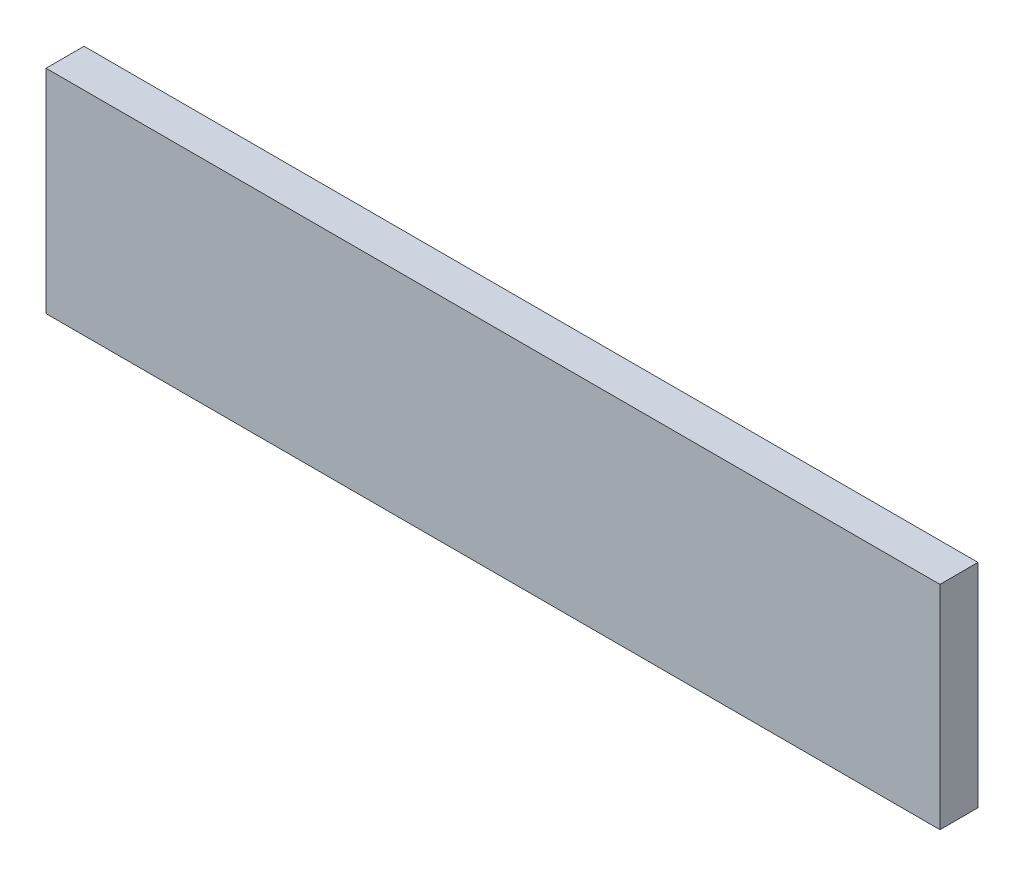
ISO-10303-21;
HEADER;
FILE_DESCRIPTION(('STEP AP214'),'2;1');
FILE_NAME('part.step','',(''),(''),'','','');
FILE_SCHEMA(('AUTOMOTIVE_DESIGN { 1 0 10303 214 1 1 1 1 }'));
ENDSEC;
DATA;
#1=APPLICATION_CONTEXT('core data for automotive mechanical design processes');
#2=APPLICATION_PROTOCOL_DEFINITION('international standard','automotive_design',2000,#1);
#3=PRODUCT_CONTEXT('',#1,'mechanical');
#4=PRODUCT('Part','Part','',(#3));
#5=PRODUCT_RELATED_PRODUCT_CATEGORY('part','',(#4));
#6=PRODUCT_DEFINITION_FORMATION('','',#4);
#7=PRODUCT_DEFINITION_CONTEXT('part definition',#1,'design');
#8=PRODUCT_DEFINITION('design','',#6,#7);
#9=PRODUCT_DEFINITION_SHAPE('','',#8);
#10=(LENGTH_UNIT() NAMED_UNIT(*) SI_UNIT(.MILLI.,.METRE.));
#11=(NAMED_UNIT(*) PLANE_ANGLE_UNIT() SI_UNIT($,.RADIAN.));
#12=(NAMED_UNIT(*) SI_UNIT($,.STERADIAN.) SOLID_ANGLE_UNIT());
#13=UNCERTAINTY_MEASURE_WITH_UNIT(LENGTH_MEASURE(1.E-05),#10,'distance_accuracy_value','');
#14=(GEOMETRIC_REPRESENTATION_CONTEXT(3) GLOBAL_UNCERTAINTY_ASSIGNED_CONTEXT((#13)) GLOBAL_UNIT_ASSIGNED_CONTEXT((#10,
#11,#12)) REPRESENTATION_CONTEXT('',''));
#15=CARTESIAN_POINT('',(0.,0.,0.));
#16=DIRECTION('',(0.,0.,1.));
#17=DIRECTION('',(1.,0.,0.));
#18=AXIS2_PLACEMENT_3D('',#15,#16,#17);
#19=CARTESIAN_POINT('',(117.490354466706,-27.9262111469158,10.));
#20=DIRECTION('',(-1.,0.,0.));
#21=DIRECTION('',(0.,0.,1.));
#22=AXIS2_PLACEMENT_3D('',#19,#20,#21);
#23=PLANE('',#22);
#24=DIRECTION('',(0.,1.,0.));
#25=VECTOR('',#24,1.);
#26=CARTESIAN_POINT('',(117.490354466706,-27.9262111469158,0.));
#27=LINE('',#26,#25);
#28=CARTESIAN_POINT('',(117.490354466706,-27.9262111469158,0.));
#29=VERTEX_POINT('',#28);
#30=CARTESIAN_POINT('',(117.490354466706,27.9262111469158,0.));
#31=VERTEX_POINT('',#30);
#32=EDGE_CURVE('E102',#29,#31,#27,.T.);
#33=ORIENTED_EDGE('',*,*,#32,.T.);
#34=DIRECTION('',(0.,0.,-1.));
#35=VECTOR('',#34,1.);
#36=CARTESIAN_POINT('',(117.490354466706,27.9262111469158,10.));
#37=LINE('',#36,#35);
#38=CARTESIAN_POINT('',(117.490354466706,27.9262111469158,10.));
#39=VERTEX_POINT('',#38);
#40=EDGE_CURVE('E11',#39,#31,#37,.T.);
#41=ORIENTED_EDGE('',*,*,#40,.F.);
#42=DIRECTION('',(0.,1.,0.));
#43=VECTOR('',#42,1.);
#44=CARTESIAN_POINT('',(117.490354466706,-27.9262111469158,10.));
#45=LINE('',#44,#43);
#46=CARTESIAN_POINT('',(117.490354466706,-27.9262111469158,10.));
#47=VERTEX_POINT('',#46);
#48=EDGE_CURVE('E90',#47,#39,#45,.T.);
#49=ORIENTED_EDGE('',*,*,#48,.F.);
#50=DIRECTION('',(0.,0.,-1.));
#51=VECTOR('',#50,1.);
#52=CARTESIAN_POINT('',(117.490354466706,-27.9262111469158,10.));
#53=LINE('',#52,#51);
#54=EDGE_CURVE('E98',#47,#29,#53,.T.);
#55=ORIENTED_EDGE('',*,*,#54,.T.);
#56=EDGE_LOOP('',(#33,#41,#49,#55));
#57=FACE_BOUND('',#56,.T.);
#58=ADVANCED_FACE('F39',(#57),#23,.F.);
#59=CARTESIAN_POINT('',(-117.490354466706,27.9262111469158,10.));
#60=DIRECTION('',(0.,-1.,0.));
#61=DIRECTION('',(0.,0.,-1.));
#62=AXIS2_PLACEMENT_3D('',#59,#60,#61);
#63=PLANE('',#62);
#64=DIRECTION('',(-1.,0.,0.));
#65=VECTOR('',#64,1.);
#66=CARTESIAN_POINT('',(-117.490354466706,27.9262111469158,0.));
#67=LINE('',#66,#65);
#68=CARTESIAN_POINT('',(-117.490354466706,27.9262111469158,0.));
#69=VERTEX_POINT('',#68);
#70=EDGE_CURVE('E94',#31,#69,#67,.T.);
#71=ORIENTED_EDGE('',*,*,#70,.T.);
#72=DIRECTION('',(0.,0.,-1.));
#73=VECTOR('',#72,1.);
#74=CARTESIAN_POINT('',(-117.490354466706,27.9262111469158,10.));
#75=LINE('',#74,#73);
#76=CARTESIAN_POINT('',(-117.490354466706,27.9262111469158,10.));
#77=VERTEX_POINT('',#76);
#78=EDGE_CURVE('E47',#77,#69,#75,.T.);
#79=ORIENTED_EDGE('',*,*,#78,.F.);
#80=DIRECTION('',(-1.,0.,0.));
#81=VECTOR('',#80,1.);
#82=CARTESIAN_POINT('',(-117.490354466706,27.9262111469158,10.));
#83=LINE('',#82,#81);
#84=EDGE_CURVE('E85',#39,#77,#83,.T.);
#85=ORIENTED_EDGE('',*,*,#84,.F.);
#86=ORIENTED_EDGE('',*,*,#40,.T.);
#87=EDGE_LOOP('',(#71,#79,#85,#86));
#88=FACE_BOUND('',#87,.T.);
#89=ADVANCED_FACE('F93',(#88),#63,.F.);
#90=CARTESIAN_POINT('',(-117.490354466706,-27.9262111469158,10.));
#91=DIRECTION('',(1.,0.,0.));
#92=DIRECTION('',(0.,0.,-1.));
#93=AXIS2_PLACEMENT_3D('',#90,#91,#92);
#94=PLANE('',#93);
#95=DIRECTION('',(0.,-1.,0.));
#96=VECTOR('',#95,1.);
#97=CARTESIAN_POINT('',(-117.490354466706,-27.9262111469158,0.));
#98=LINE('',#97,#96);
#99=CARTESIAN_POINT('',(-117.490354466706,-27.9262111469158,0.));
#100=VERTEX_POINT('',#99);
#101=EDGE_CURVE('E72',#69,#100,#98,.T.);
#102=ORIENTED_EDGE('',*,*,#101,.T.);
#103=DIRECTION('',(0.,0.,-1.));
#104=VECTOR('',#103,1.);
#105=CARTESIAN_POINT('',(-117.490354466706,-27.9262111469158,10.));
#106=LINE('',#105,#104);
#107=CARTESIAN_POINT('',(-117.490354466706,-27.9262111469158,10.));
#108=VERTEX_POINT('',#107);
#109=EDGE_CURVE('E95',#108,#100,#106,.T.);
#110=ORIENTED_EDGE('',*,*,#109,.F.);
#111=DIRECTION('',(0.,-1.,0.));
#112=VECTOR('',#111,1.);
#113=CARTESIAN_POINT('',(-117.490354466706,-27.9262111469158,10.));
#114=LINE('',#113,#112);
#115=EDGE_CURVE('E88',#77,#108,#114,.T.);
#116=ORIENTED_EDGE('',*,*,#115,.F.);
#117=ORIENTED_EDGE('',*,*,#78,.T.);
#118=EDGE_LOOP('',(#102,#110,#116,#117));
#119=FACE_BOUND('',#118,.T.);
#120=ADVANCED_FACE('F96',(#119),#94,.F.);
#121=CARTESIAN_POINT('',(-117.490354466706,-27.9262111469158,10.));
#122=DIRECTION('',(0.,1.,0.));
#123=DIRECTION('',(0.,0.,1.));
#124=AXIS2_PLACEMENT_3D('',#121,#122,#123);
#125=PLANE('',#124);
#126=DIRECTION('',(1.,0.,0.));
#127=VECTOR('',#126,1.);
#128=CARTESIAN_POINT('',(-117.490354466706,-27.9262111469158,0.));
#129=LINE('',#128,#127);
#130=EDGE_CURVE('E78',#100,#29,#129,.T.);
#131=ORIENTED_EDGE('',*,*,#130,.T.);
#132=ORIENTED_EDGE('',*,*,#54,.F.);
#133=DIRECTION('',(1.,0.,0.));
#134=VECTOR('',#133,1.);
#135=CARTESIAN_POINT('',(-117.490354466706,-27.9262111469158,10.));
#136=LINE('',#135,#134);
#137=EDGE_CURVE('E55',#108,#47,#136,.T.);
#138=ORIENTED_EDGE('',*,*,#137,.F.);
#139=ORIENTED_EDGE('',*,*,#109,.T.);
#140=EDGE_LOOP('',(#131,#132,#138,#139));
#141=FACE_BOUND('',#140,.T.);
#142=ADVANCED_FACE('F109',(#141),#125,.F.);
#143=CARTESIAN_POINT('',(117.490354466706,27.9262111469158,10.));
#144=DIRECTION('',(0.,0.,-1.));
#145=DIRECTION('',(-1.,0.,0.));
#146=AXIS2_PLACEMENT_3D('',#143,#144,#145);
#147=PLANE('',#146);
#148=ORIENTED_EDGE('',*,*,#48,.T.);
#149=ORIENTED_EDGE('',*,*,#84,.T.);
#150=ORIENTED_EDGE('',*,*,#115,.T.);
#151=ORIENTED_EDGE('',*,*,#137,.T.);
#152=EDGE_LOOP('',(#148,#149,#150,#151));
#153=FACE_BOUND('',#152,.T.);
#154=ADVANCED_FACE('F86',(#153),#147,.F.);
#155=CARTESIAN_POINT('',(117.490354466706,27.9262111469158,0.));
#156=DIRECTION('',(0.,0.,-1.));
#157=DIRECTION('',(-1.,0.,0.));
#158=AXIS2_PLACEMENT_3D('',#155,#156,#157);
#159=PLANE('',#158);
#160=ORIENTED_EDGE('',*,*,#32,.F.);
#161=ORIENTED_EDGE('',*,*,#130,.F.);
#162=ORIENTED_EDGE('',*,*,#101,.F.);
#163=ORIENTED_EDGE('',*,*,#70,.F.);
#164=EDGE_LOOP('',(#160,#161,#162,#163));
#165=FACE_BOUND('',#164,.T.);
#166=ADVANCED_FACE('F112',(#165),#159,.T.);
#167=CLOSED_SHELL('',(#58,#89,#120,#142,#154,#166));
#168=MANIFOLD_SOLID_BREP('B2',#167);
#169=ADVANCED_BREP_SHAPE_REPRESENTATION('',(#18,#168),#14);
#170=SHAPE_DEFINITION_REPRESENTATION(#9,#169);
ENDSEC;
END-ISO-10303-21;
